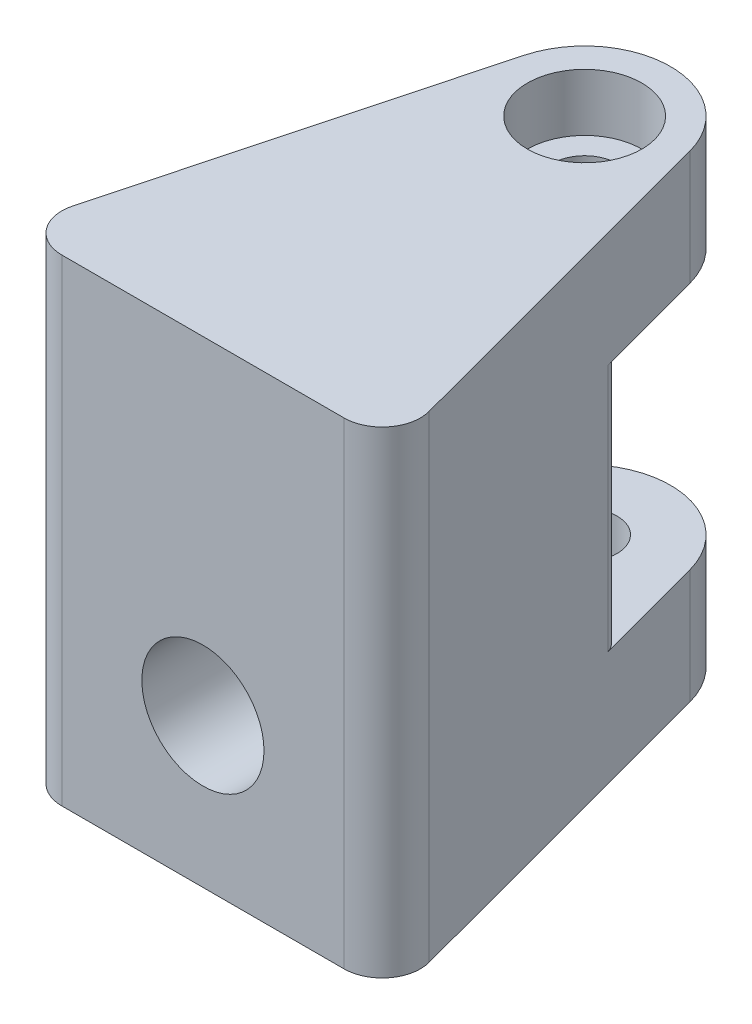
ISO-10303-21;
HEADER;
FILE_DESCRIPTION(('STEP AP214'),'2;1');
FILE_NAME('part.step','',(''),(''),'','','');
FILE_SCHEMA(('AUTOMOTIVE_DESIGN { 1 0 10303 214 1 1 1 1 }'));
ENDSEC;
DATA;
#1=APPLICATION_CONTEXT('core data for automotive mechanical design processes');
#2=APPLICATION_PROTOCOL_DEFINITION('international standard','automotive_design',2000,#1);
#3=PRODUCT_CONTEXT('',#1,'mechanical');
#4=PRODUCT('Part','Part','',(#3));
#5=PRODUCT_RELATED_PRODUCT_CATEGORY('part','',(#4));
#6=PRODUCT_DEFINITION_FORMATION('','',#4);
#7=PRODUCT_DEFINITION_CONTEXT('part definition',#1,'design');
#8=PRODUCT_DEFINITION('design','',#6,#7);
#9=PRODUCT_DEFINITION_SHAPE('','',#8);
#10=(LENGTH_UNIT() NAMED_UNIT(*) SI_UNIT(.MILLI.,.METRE.));
#11=(NAMED_UNIT(*) PLANE_ANGLE_UNIT() SI_UNIT($,.RADIAN.));
#12=(NAMED_UNIT(*) SI_UNIT($,.STERADIAN.) SOLID_ANGLE_UNIT());
#13=UNCERTAINTY_MEASURE_WITH_UNIT(LENGTH_MEASURE(1.E-05),#10,'distance_accuracy_value','');
#14=(GEOMETRIC_REPRESENTATION_CONTEXT(3) GLOBAL_UNCERTAINTY_ASSIGNED_CONTEXT((#13)) GLOBAL_UNIT_ASSIGNED_CONTEXT((#10,
#11,#12)) REPRESENTATION_CONTEXT('',''));
#15=CARTESIAN_POINT('',(0.,0.,0.));
#16=DIRECTION('',(0.,0.,1.));
#17=DIRECTION('',(1.,0.,0.));
#18=AXIS2_PLACEMENT_3D('',#15,#16,#17);
#19=CARTESIAN_POINT('',(0.,0.,0.));
#20=DIRECTION('',(0.,1.,0.));
#21=DIRECTION('',(0.,0.,1.));
#22=AXIS2_PLACEMENT_3D('',#19,#20,#21);
#23=CYLINDRICAL_SURFACE('',#22,1.7);
#24=CARTESIAN_POINT('',(0.,19.,0.));
#25=DIRECTION('',(0.,1.,0.));
#26=DIRECTION('',(0.,0.,1.));
#27=AXIS2_PLACEMENT_3D('',#24,#25,#26);
#28=CIRCLE('',#27,1.7);
#29=CARTESIAN_POINT('',(0.,19.,1.7));
#30=VERTEX_POINT('',#29);
#31=EDGE_CURVE('E207',#30,#30,#28,.F.);
#32=ORIENTED_EDGE('',*,*,#31,.T.);
#33=EDGE_LOOP('',(#32));
#34=FACE_BOUND('',#33,.T.);
#35=CARTESIAN_POINT('',(0.,22.,0.));
#36=DIRECTION('',(0.,1.,0.));
#37=DIRECTION('',(0.,0.,1.));
#38=AXIS2_PLACEMENT_3D('',#35,#36,#37);
#39=CIRCLE('',#38,1.7);
#40=CARTESIAN_POINT('',(0.,22.,1.7));
#41=VERTEX_POINT('',#40);
#42=EDGE_CURVE('E280',#41,#41,#39,.F.);
#43=ORIENTED_EDGE('',*,*,#42,.F.);
#44=EDGE_LOOP('',(#43));
#45=FACE_BOUND('',#44,.T.);
#46=ADVANCED_FACE('F43',(#34,#45),#23,.F.);
#47=CARTESIAN_POINT('',(0.,0.,0.));
#48=DIRECTION('',(0.,1.,0.));
#49=DIRECTION('',(0.,0.,1.));
#50=AXIS2_PLACEMENT_3D('',#47,#48,#49);
#51=PLANE('',#50);
#52=DIRECTION('',(-0.25806392227619,0.,-0.96612784455238));
#53=VECTOR('',#52,1.);
#54=CARTESIAN_POINT('',(10.,0.,20.));
#55=LINE('',#54,#53);
#56=CARTESIAN_POINT('',(9.32791314920194,0.,17.4838721554476));
#57=VERTEX_POINT('',#56);
#58=CARTESIAN_POINT('',(4.34757530048571,0.,-1.16128765024286));
#59=VERTEX_POINT('',#58);
#60=EDGE_CURVE('E232',#57,#59,#55,.T.);
#61=ORIENTED_EDGE('',*,*,#60,.F.);
#62=CARTESIAN_POINT('',(7.39565746009718,0.,18.));
#63=DIRECTION('',(0.,1.,0.));
#64=DIRECTION('',(0.,0.,1.));
#65=AXIS2_PLACEMENT_3D('',#62,#63,#64);
#66=CIRCLE('',#65,2.);
#67=CARTESIAN_POINT('',(7.39565746009718,0.,20.));
#68=VERTEX_POINT('',#67);
#69=EDGE_CURVE('E262',#57,#68,#66,.F.);
#70=ORIENTED_EDGE('',*,*,#69,.T.);
#71=DIRECTION('',(1.,0.,0.));
#72=VECTOR('',#71,1.);
#73=CARTESIAN_POINT('',(-10.,0.,20.));
#74=LINE('',#73,#72);
#75=CARTESIAN_POINT('',(-7.39565746009718,0.,20.));
#76=VERTEX_POINT('',#75);
#77=EDGE_CURVE('E246',#76,#68,#74,.T.);
#78=ORIENTED_EDGE('',*,*,#77,.F.);
#79=CARTESIAN_POINT('',(-7.39565746009718,0.,18.));
#80=DIRECTION('',(0.,1.,0.));
#81=DIRECTION('',(0.,0.,1.));
#82=AXIS2_PLACEMENT_3D('',#79,#80,#81);
#83=CIRCLE('',#82,2.);
#84=CARTESIAN_POINT('',(-9.32791314920194,0.,17.4838721554476));
#85=VERTEX_POINT('',#84);
#86=EDGE_CURVE('E260',#76,#85,#83,.F.);
#87=ORIENTED_EDGE('',*,*,#86,.T.);
#88=DIRECTION('',(-0.25806392227619,0.,0.96612784455238));
#89=VECTOR('',#88,1.);
#90=CARTESIAN_POINT('',(-4.34757530048571,0.,-1.16128765024286));
#91=LINE('',#90,#89);
#92=CARTESIAN_POINT('',(-4.34757530048571,0.,-1.16128765024286));
#93=VERTEX_POINT('',#92);
#94=EDGE_CURVE('E243',#93,#85,#91,.T.);
#95=ORIENTED_EDGE('',*,*,#94,.F.);
#96=CARTESIAN_POINT('',(0.,0.,0.));
#97=DIRECTION('',(0.,1.,0.));
#98=DIRECTION('',(0.,0.,1.));
#99=AXIS2_PLACEMENT_3D('',#96,#97,#98);
#100=CIRCLE('',#99,4.5);
#101=EDGE_CURVE('E225',#59,#93,#100,.T.);
#102=ORIENTED_EDGE('',*,*,#101,.F.);
#103=EDGE_LOOP('',(#61,#70,#78,#87,#95,#102));
#104=FACE_BOUND('',#103,.T.);
#105=DIRECTION('',(0.866025403784439,0.,0.5));
#106=VECTOR('',#105,1.);
#107=CARTESIAN_POINT('',(-3.,0.,1.73205080756888));
#108=LINE('',#107,#106);
#109=CARTESIAN_POINT('',(-3.,0.,1.73205080756888));
#110=VERTEX_POINT('',#109);
#111=CARTESIAN_POINT('',(0.,0.,3.46410161513776));
#112=VERTEX_POINT('',#111);
#113=EDGE_CURVE('E283',#110,#112,#108,.T.);
#114=ORIENTED_EDGE('',*,*,#113,.T.);
#115=DIRECTION('',(0.866025403784439,0.,-0.5));
#116=VECTOR('',#115,1.);
#117=CARTESIAN_POINT('',(0.,0.,3.46410161513776));
#118=LINE('',#117,#116);
#119=CARTESIAN_POINT('',(3.,0.,1.73205080756888));
#120=VERTEX_POINT('',#119);
#121=EDGE_CURVE('E191',#112,#120,#118,.T.);
#122=ORIENTED_EDGE('',*,*,#121,.T.);
#123=DIRECTION('',(0.,0.,-1.));
#124=VECTOR('',#123,1.);
#125=CARTESIAN_POINT('',(3.,0.,1.73205080756888));
#126=LINE('',#125,#124);
#127=CARTESIAN_POINT('',(3.,0.,-1.73205080756888));
#128=VERTEX_POINT('',#127);
#129=EDGE_CURVE('E605',#120,#128,#126,.T.);
#130=ORIENTED_EDGE('',*,*,#129,.T.);
#131=DIRECTION('',(-0.866025403784439,0.,-0.5));
#132=VECTOR('',#131,1.);
#133=CARTESIAN_POINT('',(3.,0.,-1.73205080756888));
#134=LINE('',#133,#132);
#135=CARTESIAN_POINT('',(0.,0.,-3.46410161513775));
#136=VERTEX_POINT('',#135);
#137=EDGE_CURVE('E608',#128,#136,#134,.T.);
#138=ORIENTED_EDGE('',*,*,#137,.T.);
#139=DIRECTION('',(-0.866025403784439,0.,0.5));
#140=VECTOR('',#139,1.);
#141=CARTESIAN_POINT('',(0.,0.,-3.46410161513775));
#142=LINE('',#141,#140);
#143=CARTESIAN_POINT('',(-3.,0.,-1.73205080756888));
#144=VERTEX_POINT('',#143);
#145=EDGE_CURVE('E611',#136,#144,#142,.T.);
#146=ORIENTED_EDGE('',*,*,#145,.T.);
#147=DIRECTION('',(0.,0.,1.));
#148=VECTOR('',#147,1.);
#149=CARTESIAN_POINT('',(-3.,0.,-1.73205080756888));
#150=LINE('',#149,#148);
#151=EDGE_CURVE('E187',#144,#110,#150,.T.);
#152=ORIENTED_EDGE('',*,*,#151,.T.);
#153=EDGE_LOOP('',(#114,#122,#130,#138,#146,#152));
#154=FACE_BOUND('',#153,.T.);
#155=ADVANCED_FACE('F316',(#104,#154),#51,.F.);
#156=CARTESIAN_POINT('',(0.,25.,0.));
#157=DIRECTION('',(0.,-1.,0.));
#158=DIRECTION('',(0.,0.,-1.));
#159=AXIS2_PLACEMENT_3D('',#156,#157,#158);
#160=CYLINDRICAL_SURFACE('',#159,4.5);
#161=CARTESIAN_POINT('',(0.,6.,0.));
#162=DIRECTION('',(0.,1.,0.));
#163=DIRECTION('',(0.,0.,1.));
#164=AXIS2_PLACEMENT_3D('',#161,#162,#163);
#165=CIRCLE('',#164,4.5);
#166=CARTESIAN_POINT('',(4.34757530048571,6.,-1.16128765024285));
#167=VERTEX_POINT('',#166);
#168=CARTESIAN_POINT('',(-4.34757530048571,6.,-1.16128765024286));
#169=VERTEX_POINT('',#168);
#170=EDGE_CURVE('E218',#167,#169,#165,.T.);
#171=ORIENTED_EDGE('',*,*,#170,.F.);
#172=DIRECTION('',(0.,-1.,0.));
#173=VECTOR('',#172,1.);
#174=CARTESIAN_POINT('',(4.34757530048571,25.,-1.16128765024286));
#175=LINE('',#174,#173);
#176=EDGE_CURVE('E240',#167,#59,#175,.T.);
#177=ORIENTED_EDGE('',*,*,#176,.T.);
#178=ORIENTED_EDGE('',*,*,#101,.T.);
#179=DIRECTION('',(0.,-1.,0.));
#180=VECTOR('',#179,1.);
#181=CARTESIAN_POINT('',(-4.34757530048571,25.,-1.16128765024286));
#182=LINE('',#181,#180);
#183=EDGE_CURVE('E254',#169,#93,#182,.T.);
#184=ORIENTED_EDGE('',*,*,#183,.F.);
#185=EDGE_LOOP('',(#171,#177,#178,#184));
#186=FACE_BOUND('',#185,.T.);
#187=ADVANCED_FACE('F311',(#186),#160,.T.);
#188=CARTESIAN_POINT('',(-4.34757530048571,25.,-1.16128765024286));
#189=DIRECTION('',(0.96612784455238,0.,0.25806392227619));
#190=DIRECTION('',(0.25806392227619,0.,-0.96612784455238));
#191=AXIS2_PLACEMENT_3D('',#188,#189,#190);
#192=PLANE('',#191);
#193=DIRECTION('',(-0.25806392227619,0.,0.96612784455238));
#194=VECTOR('',#193,1.);
#195=CARTESIAN_POINT('',(-4.34757530048571,19.,-1.16128765024286));
#196=LINE('',#195,#194);
#197=CARTESIAN_POINT('',(-4.34757530048571,19.,-1.16128765024286));
#198=VERTEX_POINT('',#197);
#199=CARTESIAN_POINT('',(-5.91200468792575,19.,4.6955511465582));
#200=VERTEX_POINT('',#199);
#201=EDGE_CURVE('E58',#198,#200,#196,.T.);
#202=ORIENTED_EDGE('',*,*,#201,.T.);
#203=DIRECTION('',(0.,1.,0.));
#204=VECTOR('',#203,1.);
#205=CARTESIAN_POINT('',(-5.91200468792575,6.,4.6955511465582));
#206=LINE('',#205,#204);
#207=CARTESIAN_POINT('',(-5.91200468792575,6.,4.6955511465582));
#208=VERTEX_POINT('',#207);
#209=EDGE_CURVE('E293',#200,#208,#206,.F.);
#210=ORIENTED_EDGE('',*,*,#209,.T.);
#211=DIRECTION('',(-0.25806392227619,0.,0.96612784455238));
#212=VECTOR('',#211,1.);
#213=CARTESIAN_POINT('',(-4.34757530048571,6.,-1.16128765024286));
#214=LINE('',#213,#212);
#215=EDGE_CURVE('E65',#169,#208,#214,.T.);
#216=ORIENTED_EDGE('',*,*,#215,.F.);
#217=ORIENTED_EDGE('',*,*,#183,.T.);
#218=ORIENTED_EDGE('',*,*,#94,.T.);
#219=DIRECTION('',(0.,-1.,0.));
#220=VECTOR('',#219,1.);
#221=CARTESIAN_POINT('',(-9.32791314920194,25.,17.4838721554476));
#222=LINE('',#221,#220);
#223=CARTESIAN_POINT('',(-9.32791314920194,25.,17.4838721554476));
#224=VERTEX_POINT('',#223);
#225=EDGE_CURVE('E273',#85,#224,#222,.F.);
#226=ORIENTED_EDGE('',*,*,#225,.T.);
#227=DIRECTION('',(-0.25806392227619,0.,0.96612784455238));
#228=VECTOR('',#227,1.);
#229=CARTESIAN_POINT('',(-4.34757530048571,25.,-1.16128765024286));
#230=LINE('',#229,#228);
#231=CARTESIAN_POINT('',(-4.34757530048571,25.,-1.16128765024286));
#232=VERTEX_POINT('',#231);
#233=EDGE_CURVE('E231',#232,#224,#230,.T.);
#234=ORIENTED_EDGE('',*,*,#233,.F.);
#235=EDGE_CURVE('E255',#232,#198,#182,.T.);
#236=ORIENTED_EDGE('',*,*,#235,.T.);
#237=EDGE_LOOP('',(#202,#210,#216,#217,#218,#226,#234,#236));
#238=FACE_BOUND('',#237,.T.);
#239=ADVANCED_FACE('F306',(#238),#192,.F.);
#240=CARTESIAN_POINT('',(10.,25.,20.));
#241=DIRECTION('',(-0.96612784455238,0.,0.25806392227619));
#242=DIRECTION('',(0.25806392227619,0.,0.96612784455238));
#243=AXIS2_PLACEMENT_3D('',#240,#241,#242);
#244=PLANE('',#243);
#245=DIRECTION('',(-0.25806392227619,0.,-0.96612784455238));
#246=VECTOR('',#245,1.);
#247=CARTESIAN_POINT('',(10.,6.,20.));
#248=LINE('',#247,#246);
#249=CARTESIAN_POINT('',(5.91200468792575,6.,4.6955511465582));
#250=VERTEX_POINT('',#249);
#251=EDGE_CURVE('E216',#250,#167,#248,.T.);
#252=ORIENTED_EDGE('',*,*,#251,.F.);
#253=DIRECTION('',(0.,1.,0.));
#254=VECTOR('',#253,1.);
#255=CARTESIAN_POINT('',(5.91200468792575,19.,4.6955511465582));
#256=LINE('',#255,#254);
#257=CARTESIAN_POINT('',(5.91200468792574,19.,4.69555114655819));
#258=VERTEX_POINT('',#257);
#259=EDGE_CURVE('E290',#250,#258,#256,.T.);
#260=ORIENTED_EDGE('',*,*,#259,.T.);
#261=DIRECTION('',(-0.25806392227619,0.,-0.96612784455238));
#262=VECTOR('',#261,1.);
#263=CARTESIAN_POINT('',(10.,19.,20.));
#264=LINE('',#263,#262);
#265=CARTESIAN_POINT('',(4.34757530048571,19.,-1.16128765024286));
#266=VERTEX_POINT('',#265);
#267=EDGE_CURVE('E208',#258,#266,#264,.T.);
#268=ORIENTED_EDGE('',*,*,#267,.T.);
#269=CARTESIAN_POINT('',(4.34757530048571,25.,-1.16128765024286));
#270=VERTEX_POINT('',#269);
#271=EDGE_CURVE('E251',#270,#266,#175,.T.);
#272=ORIENTED_EDGE('',*,*,#271,.F.);
#273=DIRECTION('',(-0.25806392227619,0.,-0.96612784455238));
#274=VECTOR('',#273,1.);
#275=CARTESIAN_POINT('',(10.,25.,20.));
#276=LINE('',#275,#274);
#277=CARTESIAN_POINT('',(9.32791314920194,25.,17.4838721554476));
#278=VERTEX_POINT('',#277);
#279=EDGE_CURVE('E238',#278,#270,#276,.T.);
#280=ORIENTED_EDGE('',*,*,#279,.F.);
#281=DIRECTION('',(0.,-1.,0.));
#282=VECTOR('',#281,1.);
#283=CARTESIAN_POINT('',(9.32791314920194,25.,17.4838721554476));
#284=LINE('',#283,#282);
#285=EDGE_CURVE('E257',#278,#57,#284,.T.);
#286=ORIENTED_EDGE('',*,*,#285,.T.);
#287=ORIENTED_EDGE('',*,*,#60,.T.);
#288=ORIENTED_EDGE('',*,*,#176,.F.);
#289=EDGE_LOOP('',(#252,#260,#268,#272,#280,#286,#287,#288));
#290=FACE_BOUND('',#289,.T.);
#291=ADVANCED_FACE('F337',(#290),#244,.F.);
#292=CARTESIAN_POINT('',(0.,2.4,0.));
#293=DIRECTION('',(0.,1.,0.));
#294=DIRECTION('',(0.,0.,1.));
#295=AXIS2_PLACEMENT_3D('',#292,#293,#294);
#296=CIRCLE('',#295,1.7);
#297=CARTESIAN_POINT('',(0.,2.4,1.7));
#298=VERTEX_POINT('',#297);
#299=EDGE_CURVE('E192',#298,#298,#296,.F.);
#300=ORIENTED_EDGE('',*,*,#299,.T.);
#301=EDGE_LOOP('',(#300));
#302=FACE_BOUND('',#301,.T.);
#303=CARTESIAN_POINT('',(0.,6.,0.));
#304=DIRECTION('',(0.,1.,0.));
#305=DIRECTION('',(0.,0.,1.));
#306=AXIS2_PLACEMENT_3D('',#303,#304,#305);
#307=CIRCLE('',#306,1.7);
#308=CARTESIAN_POINT('',(0.,6.,1.7));
#309=VERTEX_POINT('',#308);
#310=EDGE_CURVE('E215',#309,#309,#307,.F.);
#311=ORIENTED_EDGE('',*,*,#310,.F.);
#312=EDGE_LOOP('',(#311));
#313=FACE_BOUND('',#312,.T.);
#314=ADVANCED_FACE('F365',(#302,#313),#23,.F.);
#315=ORIENTED_EDGE('',*,*,#271,.T.);
#316=CARTESIAN_POINT('',(0.,19.,0.));
#317=DIRECTION('',(0.,1.,0.));
#318=DIRECTION('',(0.,0.,1.));
#319=AXIS2_PLACEMENT_3D('',#316,#317,#318);
#320=CIRCLE('',#319,4.5);
#321=EDGE_CURVE('E211',#266,#198,#320,.T.);
#322=ORIENTED_EDGE('',*,*,#321,.T.);
#323=ORIENTED_EDGE('',*,*,#235,.F.);
#324=CARTESIAN_POINT('',(0.,25.,0.));
#325=DIRECTION('',(0.,1.,0.));
#326=DIRECTION('',(0.,0.,1.));
#327=AXIS2_PLACEMENT_3D('',#324,#325,#326);
#328=CIRCLE('',#327,4.5);
#329=EDGE_CURVE('E228',#270,#232,#328,.T.);
#330=ORIENTED_EDGE('',*,*,#329,.F.);
#331=EDGE_LOOP('',(#315,#322,#323,#330));
#332=FACE_BOUND('',#331,.T.);
#333=ADVANCED_FACE('F341',(#332),#160,.T.);
#334=CARTESIAN_POINT('',(-10.,25.,20.));
#335=DIRECTION('',(0.,0.,-1.));
#336=DIRECTION('',(-1.,0.,0.));
#337=AXIS2_PLACEMENT_3D('',#334,#335,#336);
#338=PLANE('',#337);
#339=CARTESIAN_POINT('',(0.,7.8,20.));
#340=DIRECTION('',(0.,0.,1.));
#341=DIRECTION('',(1.,0.,0.));
#342=AXIS2_PLACEMENT_3D('',#339,#340,#341);
#343=CIRCLE('',#342,3.2);
#344=CARTESIAN_POINT('',(3.2,7.8,20.));
#345=VERTEX_POINT('',#344);
#346=EDGE_CURVE('E221',#345,#345,#343,.T.);
#347=ORIENTED_EDGE('',*,*,#346,.F.);
#348=EDGE_LOOP('',(#347));
#349=FACE_BOUND('',#348,.T.);
#350=ORIENTED_EDGE('',*,*,#77,.T.);
#351=DIRECTION('',(0.,-1.,0.));
#352=VECTOR('',#351,1.);
#353=CARTESIAN_POINT('',(7.39565746009718,25.,20.));
#354=LINE('',#353,#352);
#355=CARTESIAN_POINT('',(7.39565746009718,25.,20.));
#356=VERTEX_POINT('',#355);
#357=EDGE_CURVE('E267',#68,#356,#354,.F.);
#358=ORIENTED_EDGE('',*,*,#357,.T.);
#359=DIRECTION('',(1.,0.,0.));
#360=VECTOR('',#359,1.);
#361=CARTESIAN_POINT('',(-10.,25.,20.));
#362=LINE('',#361,#360);
#363=CARTESIAN_POINT('',(-7.39565746009718,25.,20.));
#364=VERTEX_POINT('',#363);
#365=EDGE_CURVE('E235',#364,#356,#362,.T.);
#366=ORIENTED_EDGE('',*,*,#365,.F.);
#367=DIRECTION('',(0.,-1.,0.));
#368=VECTOR('',#367,1.);
#369=CARTESIAN_POINT('',(-7.39565746009718,25.,20.));
#370=LINE('',#369,#368);
#371=EDGE_CURVE('E264',#364,#76,#370,.T.);
#372=ORIENTED_EDGE('',*,*,#371,.T.);
#373=EDGE_LOOP('',(#350,#358,#366,#372));
#374=FACE_BOUND('',#373,.T.);
#375=ADVANCED_FACE('F329',(#349,#374),#338,.F.);
#376=CARTESIAN_POINT('',(0.,25.,0.));
#377=DIRECTION('',(0.,1.,0.));
#378=DIRECTION('',(0.,0.,1.));
#379=AXIS2_PLACEMENT_3D('',#376,#377,#378);
#380=PLANE('',#379);
#381=CARTESIAN_POINT('',(0.,25.,0.));
#382=DIRECTION('',(0.,1.,0.));
#383=DIRECTION('',(0.,0.,1.));
#384=AXIS2_PLACEMENT_3D('',#381,#382,#383);
#385=CIRCLE('',#384,3.);
#386=CARTESIAN_POINT('',(0.,25.,3.));
#387=VERTEX_POINT('',#386);
#388=EDGE_CURVE('E590',#387,#387,#385,.T.);
#389=ORIENTED_EDGE('',*,*,#388,.F.);
#390=EDGE_LOOP('',(#389));
#391=FACE_BOUND('',#390,.T.);
#392=ORIENTED_EDGE('',*,*,#365,.T.);
#393=CARTESIAN_POINT('',(7.39565746009718,25.,18.));
#394=DIRECTION('',(0.,1.,0.));
#395=DIRECTION('',(0.,0.,1.));
#396=AXIS2_PLACEMENT_3D('',#393,#394,#395);
#397=CIRCLE('',#396,2.);
#398=EDGE_CURVE('E271',#356,#278,#397,.T.);
#399=ORIENTED_EDGE('',*,*,#398,.T.);
#400=ORIENTED_EDGE('',*,*,#279,.T.);
#401=ORIENTED_EDGE('',*,*,#329,.T.);
#402=ORIENTED_EDGE('',*,*,#233,.T.);
#403=CARTESIAN_POINT('',(-7.39565746009718,25.,18.));
#404=DIRECTION('',(0.,1.,0.));
#405=DIRECTION('',(0.,0.,1.));
#406=AXIS2_PLACEMENT_3D('',#403,#404,#405);
#407=CIRCLE('',#406,2.);
#408=EDGE_CURVE('E269',#224,#364,#407,.T.);
#409=ORIENTED_EDGE('',*,*,#408,.T.);
#410=EDGE_LOOP('',(#392,#399,#400,#401,#402,#409));
#411=FACE_BOUND('',#410,.T.);
#412=ADVANCED_FACE('F326',(#391,#411),#380,.T.);
#413=CARTESIAN_POINT('',(0.,7.8,8.));
#414=DIRECTION('',(0.,0.,1.));
#415=DIRECTION('',(1.,0.,0.));
#416=AXIS2_PLACEMENT_3D('',#413,#414,#415);
#417=CYLINDRICAL_SURFACE('',#416,3.2);
#418=CARTESIAN_POINT('',(0.,7.8,8.));
#419=DIRECTION('',(0.,0.,1.));
#420=DIRECTION('',(1.,0.,0.));
#421=AXIS2_PLACEMENT_3D('',#418,#419,#420);
#422=CIRCLE('',#421,3.2);
#423=CARTESIAN_POINT('',(3.2,7.8,8.));
#424=VERTEX_POINT('',#423);
#425=EDGE_CURVE('E222',#424,#424,#422,.T.);
#426=ORIENTED_EDGE('',*,*,#425,.F.);
#427=EDGE_LOOP('',(#426));
#428=FACE_BOUND('',#427,.T.);
#429=ORIENTED_EDGE('',*,*,#346,.T.);
#430=EDGE_LOOP('',(#429));
#431=FACE_BOUND('',#430,.T.);
#432=ADVANCED_FACE('F549',(#428,#431),#417,.F.);
#433=CARTESIAN_POINT('',(0.,7.8,8.));
#434=DIRECTION('',(0.,0.,1.));
#435=DIRECTION('',(1.,0.,0.));
#436=AXIS2_PLACEMENT_3D('',#433,#434,#435);
#437=PLANE('',#436);
#438=ORIENTED_EDGE('',*,*,#425,.T.);
#439=EDGE_LOOP('',(#438));
#440=FACE_BOUND('',#439,.T.);
#441=ADVANCED_FACE('F540',(#440),#437,.T.);
#442=CARTESIAN_POINT('',(7.39565746009718,25.,18.));
#443=DIRECTION('',(0.,-1.,0.));
#444=DIRECTION('',(0.,0.,-1.));
#445=AXIS2_PLACEMENT_3D('',#442,#443,#444);
#446=CYLINDRICAL_SURFACE('',#445,2.);
#447=ORIENTED_EDGE('',*,*,#398,.F.);
#448=ORIENTED_EDGE('',*,*,#357,.F.);
#449=ORIENTED_EDGE('',*,*,#69,.F.);
#450=ORIENTED_EDGE('',*,*,#285,.F.);
#451=EDGE_LOOP('',(#447,#448,#449,#450));
#452=FACE_BOUND('',#451,.T.);
#453=ADVANCED_FACE('F332',(#452),#446,.T.);
#454=CARTESIAN_POINT('',(-7.39565746009718,25.,18.));
#455=DIRECTION('',(0.,-1.,0.));
#456=DIRECTION('',(0.,0.,-1.));
#457=AXIS2_PLACEMENT_3D('',#454,#455,#456);
#458=CYLINDRICAL_SURFACE('',#457,2.);
#459=ORIENTED_EDGE('',*,*,#408,.F.);
#460=ORIENTED_EDGE('',*,*,#225,.F.);
#461=ORIENTED_EDGE('',*,*,#86,.F.);
#462=ORIENTED_EDGE('',*,*,#371,.F.);
#463=EDGE_LOOP('',(#459,#460,#461,#462));
#464=FACE_BOUND('',#463,.T.);
#465=ADVANCED_FACE('F322',(#464),#458,.T.);
#466=CARTESIAN_POINT('',(0.,41.9705627484771,0.));
#467=DIRECTION('',(0.,-1.,0.));
#468=DIRECTION('',(0.,0.,-1.));
#469=AXIS2_PLACEMENT_3D('',#466,#467,#468);
#470=CYLINDRICAL_SURFACE('',#469,6.);
#471=CARTESIAN_POINT('',(0.,19.,0.));
#472=DIRECTION('',(0.,1.,0.));
#473=DIRECTION('',(0.,0.,1.));
#474=AXIS2_PLACEMENT_3D('',#471,#472,#473);
#475=CIRCLE('',#474,6.);
#476=CARTESIAN_POINT('',(-4.23932300860574,19.,4.24595577328662));
#477=VERTEX_POINT('',#476);
#478=CARTESIAN_POINT('',(4.23932300860574,19.,4.24595577328662));
#479=VERTEX_POINT('',#478);
#480=EDGE_CURVE('E204',#477,#479,#475,.T.);
#481=ORIENTED_EDGE('',*,*,#480,.T.);
#482=DIRECTION('',(0.,-1.,0.));
#483=VECTOR('',#482,1.);
#484=CARTESIAN_POINT('',(4.23932300860574,41.9705627484771,4.24595577328662));
#485=LINE('',#484,#483);
#486=CARTESIAN_POINT('',(4.23932300860574,6.,4.24595577328662));
#487=VERTEX_POINT('',#486);
#488=EDGE_CURVE('E287',#479,#487,#485,.T.);
#489=ORIENTED_EDGE('',*,*,#488,.T.);
#490=CARTESIAN_POINT('',(0.,6.,0.));
#491=DIRECTION('',(0.,1.,0.));
#492=DIRECTION('',(0.,0.,1.));
#493=AXIS2_PLACEMENT_3D('',#490,#491,#492);
#494=CIRCLE('',#493,6.);
#495=CARTESIAN_POINT('',(-4.23932300860574,6.,4.24595577328662));
#496=VERTEX_POINT('',#495);
#497=EDGE_CURVE('E196',#496,#487,#494,.T.);
#498=ORIENTED_EDGE('',*,*,#497,.F.);
#499=DIRECTION('',(0.,-1.,0.));
#500=VECTOR('',#499,1.);
#501=CARTESIAN_POINT('',(-4.23932300860574,41.9705627484771,4.24595577328662));
#502=LINE('',#501,#500);
#503=EDGE_CURVE('E275',#496,#477,#502,.F.);
#504=ORIENTED_EDGE('',*,*,#503,.T.);
#505=EDGE_LOOP('',(#481,#489,#498,#504));
#506=FACE_BOUND('',#505,.T.);
#507=ADVANCED_FACE('F349',(#506),#470,.F.);
#508=CARTESIAN_POINT('',(0.,6.,0.));
#509=DIRECTION('',(0.,1.,0.));
#510=DIRECTION('',(0.,0.,1.));
#511=AXIS2_PLACEMENT_3D('',#508,#509,#510);
#512=PLANE('',#511);
#513=ORIENTED_EDGE('',*,*,#310,.T.);
#514=EDGE_LOOP('',(#513));
#515=FACE_BOUND('',#514,.T.);
#516=ORIENTED_EDGE('',*,*,#215,.T.);
#517=CARTESIAN_POINT('',(-4.94587684337337,6.,4.95361506883439));
#518=DIRECTION('',(0.,1.,0.));
#519=DIRECTION('',(0.,0.,1.));
#520=AXIS2_PLACEMENT_3D('',#517,#518,#519);
#521=CIRCLE('',#520,1.);
#522=EDGE_CURVE('E12',#208,#496,#521,.F.);
#523=ORIENTED_EDGE('',*,*,#522,.T.);
#524=ORIENTED_EDGE('',*,*,#497,.T.);
#525=CARTESIAN_POINT('',(4.94587684337337,6.,4.95361506883439));
#526=DIRECTION('',(0.,1.,0.));
#527=DIRECTION('',(0.,0.,1.));
#528=AXIS2_PLACEMENT_3D('',#525,#526,#527);
#529=CIRCLE('',#528,1.);
#530=EDGE_CURVE('E295',#487,#250,#529,.F.);
#531=ORIENTED_EDGE('',*,*,#530,.T.);
#532=ORIENTED_EDGE('',*,*,#251,.T.);
#533=ORIENTED_EDGE('',*,*,#170,.T.);
#534=EDGE_LOOP('',(#516,#523,#524,#531,#532,#533));
#535=FACE_BOUND('',#534,.T.);
#536=ADVANCED_FACE('F350',(#515,#535),#512,.T.);
#537=CARTESIAN_POINT('',(0.,19.,0.));
#538=DIRECTION('',(0.,1.,0.));
#539=DIRECTION('',(0.,0.,1.));
#540=AXIS2_PLACEMENT_3D('',#537,#538,#539);
#541=PLANE('',#540);
#542=ORIENTED_EDGE('',*,*,#31,.F.);
#543=EDGE_LOOP('',(#542));
#544=FACE_BOUND('',#543,.T.);
#545=ORIENTED_EDGE('',*,*,#321,.F.);
#546=ORIENTED_EDGE('',*,*,#267,.F.);
#547=CARTESIAN_POINT('',(4.94587684337337,19.,4.95361506883439));
#548=DIRECTION('',(0.,1.,0.));
#549=DIRECTION('',(0.,0.,1.));
#550=AXIS2_PLACEMENT_3D('',#547,#548,#549);
#551=CIRCLE('',#550,1.);
#552=EDGE_CURVE('E298',#258,#479,#551,.T.);
#553=ORIENTED_EDGE('',*,*,#552,.T.);
#554=ORIENTED_EDGE('',*,*,#480,.F.);
#555=CARTESIAN_POINT('',(-4.94587684337337,19.,4.95361506883439));
#556=DIRECTION('',(0.,1.,0.));
#557=DIRECTION('',(0.,0.,1.));
#558=AXIS2_PLACEMENT_3D('',#555,#556,#557);
#559=CIRCLE('',#558,1.);
#560=EDGE_CURVE('E51',#477,#200,#559,.T.);
#561=ORIENTED_EDGE('',*,*,#560,.T.);
#562=ORIENTED_EDGE('',*,*,#201,.F.);
#563=EDGE_LOOP('',(#545,#546,#553,#554,#561,#562));
#564=FACE_BOUND('',#563,.T.);
#565=ADVANCED_FACE('F302',(#544,#564),#541,.F.);
#566=CARTESIAN_POINT('',(0.,2.4,0.));
#567=DIRECTION('',(0.,1.,0.));
#568=DIRECTION('',(0.,0.,1.));
#569=AXIS2_PLACEMENT_3D('',#566,#567,#568);
#570=PLANE('',#569);
#571=DIRECTION('',(0.866025403784439,0.,0.5));
#572=VECTOR('',#571,1.);
#573=CARTESIAN_POINT('',(-3.,2.4,1.73205080756888));
#574=LINE('',#573,#572);
#575=CARTESIAN_POINT('',(-3.,2.4,1.73205080756888));
#576=VERTEX_POINT('',#575);
#577=CARTESIAN_POINT('',(0.,2.4,3.46410161513776));
#578=VERTEX_POINT('',#577);
#579=EDGE_CURVE('E172',#576,#578,#574,.T.);
#580=ORIENTED_EDGE('',*,*,#579,.F.);
#581=DIRECTION('',(0.,0.,1.));
#582=VECTOR('',#581,1.);
#583=CARTESIAN_POINT('',(-3.,2.4,-1.73205080756888));
#584=LINE('',#583,#582);
#585=CARTESIAN_POINT('',(-3.,2.4,-1.73205080756888));
#586=VERTEX_POINT('',#585);
#587=EDGE_CURVE('E601',#586,#576,#584,.T.);
#588=ORIENTED_EDGE('',*,*,#587,.F.);
#589=DIRECTION('',(-0.866025403784439,0.,0.5));
#590=VECTOR('',#589,1.);
#591=CARTESIAN_POINT('',(0.,2.4,-3.46410161513775));
#592=LINE('',#591,#590);
#593=CARTESIAN_POINT('',(0.,2.4,-3.46410161513775));
#594=VERTEX_POINT('',#593);
#595=EDGE_CURVE('E599',#594,#586,#592,.T.);
#596=ORIENTED_EDGE('',*,*,#595,.F.);
#597=DIRECTION('',(-0.866025403784439,0.,-0.5));
#598=VECTOR('',#597,1.);
#599=CARTESIAN_POINT('',(3.,2.4,-1.73205080756888));
#600=LINE('',#599,#598);
#601=CARTESIAN_POINT('',(3.,2.4,-1.73205080756888));
#602=VERTEX_POINT('',#601);
#603=EDGE_CURVE('E597',#602,#594,#600,.T.);
#604=ORIENTED_EDGE('',*,*,#603,.F.);
#605=DIRECTION('',(0.,0.,-1.));
#606=VECTOR('',#605,1.);
#607=CARTESIAN_POINT('',(3.,2.4,1.73205080756888));
#608=LINE('',#607,#606);
#609=CARTESIAN_POINT('',(3.,2.4,1.73205080756888));
#610=VERTEX_POINT('',#609);
#611=EDGE_CURVE('E174',#610,#602,#608,.T.);
#612=ORIENTED_EDGE('',*,*,#611,.F.);
#613=DIRECTION('',(0.866025403784439,0.,-0.5));
#614=VECTOR('',#613,1.);
#615=CARTESIAN_POINT('',(0.,2.4,3.46410161513776));
#616=LINE('',#615,#614);
#617=EDGE_CURVE('E167',#578,#610,#616,.T.);
#618=ORIENTED_EDGE('',*,*,#617,.F.);
#619=EDGE_LOOP('',(#580,#588,#596,#604,#612,#618));
#620=FACE_BOUND('',#619,.T.);
#621=ORIENTED_EDGE('',*,*,#299,.F.);
#622=EDGE_LOOP('',(#621));
#623=FACE_BOUND('',#622,.T.);
#624=ADVANCED_FACE('F169',(#620,#623),#570,.F.);
#625=CARTESIAN_POINT('',(-3.,2.4,1.73205080756888));
#626=DIRECTION('',(0.5,0.,-0.866025403784439));
#627=DIRECTION('',(-0.866025403784439,0.,-0.5));
#628=AXIS2_PLACEMENT_3D('',#625,#626,#627);
#629=PLANE('',#628);
#630=ORIENTED_EDGE('',*,*,#113,.F.);
#631=DIRECTION('',(0.,-1.,0.));
#632=VECTOR('',#631,1.);
#633=CARTESIAN_POINT('',(-3.,2.4,1.73205080756888));
#634=LINE('',#633,#632);
#635=EDGE_CURVE('E186',#576,#110,#634,.T.);
#636=ORIENTED_EDGE('',*,*,#635,.F.);
#637=ORIENTED_EDGE('',*,*,#579,.T.);
#638=DIRECTION('',(0.,-1.,0.));
#639=VECTOR('',#638,1.);
#640=CARTESIAN_POINT('',(0.,2.4,3.46410161513776));
#641=LINE('',#640,#639);
#642=EDGE_CURVE('E183',#578,#112,#641,.T.);
#643=ORIENTED_EDGE('',*,*,#642,.T.);
#644=EDGE_LOOP('',(#630,#636,#637,#643));
#645=FACE_BOUND('',#644,.T.);
#646=ADVANCED_FACE('F182',(#645),#629,.T.);
#647=CARTESIAN_POINT('',(0.,2.4,3.46410161513776));
#648=DIRECTION('',(-0.5,0.,-0.866025403784439));
#649=DIRECTION('',(-0.866025403784439,0.,0.5));
#650=AXIS2_PLACEMENT_3D('',#647,#648,#649);
#651=PLANE('',#650);
#652=ORIENTED_EDGE('',*,*,#121,.F.);
#653=ORIENTED_EDGE('',*,*,#642,.F.);
#654=ORIENTED_EDGE('',*,*,#617,.T.);
#655=DIRECTION('',(0.,-1.,0.));
#656=VECTOR('',#655,1.);
#657=CARTESIAN_POINT('',(3.,2.4,1.73205080756888));
#658=LINE('',#657,#656);
#659=EDGE_CURVE('E193',#610,#120,#658,.T.);
#660=ORIENTED_EDGE('',*,*,#659,.T.);
#661=EDGE_LOOP('',(#652,#653,#654,#660));
#662=FACE_BOUND('',#661,.T.);
#663=ADVANCED_FACE('F189',(#662),#651,.T.);
#664=CARTESIAN_POINT('',(3.,2.4,1.73205080756888));
#665=DIRECTION('',(-1.,0.,0.));
#666=DIRECTION('',(0.,0.,1.));
#667=AXIS2_PLACEMENT_3D('',#664,#665,#666);
#668=PLANE('',#667);
#669=ORIENTED_EDGE('',*,*,#129,.F.);
#670=ORIENTED_EDGE('',*,*,#659,.F.);
#671=ORIENTED_EDGE('',*,*,#611,.T.);
#672=DIRECTION('',(0.,-1.,0.));
#673=VECTOR('',#672,1.);
#674=CARTESIAN_POINT('',(3.,2.4,-1.73205080756888));
#675=LINE('',#674,#673);
#676=EDGE_CURVE('E198',#602,#128,#675,.T.);
#677=ORIENTED_EDGE('',*,*,#676,.T.);
#678=EDGE_LOOP('',(#669,#670,#671,#677));
#679=FACE_BOUND('',#678,.T.);
#680=ADVANCED_FACE('F404',(#679),#668,.T.);
#681=CARTESIAN_POINT('',(3.,2.4,-1.73205080756888));
#682=DIRECTION('',(-0.5,0.,0.866025403784439));
#683=DIRECTION('',(0.866025403784439,0.,0.5));
#684=AXIS2_PLACEMENT_3D('',#681,#682,#683);
#685=PLANE('',#684);
#686=ORIENTED_EDGE('',*,*,#137,.F.);
#687=ORIENTED_EDGE('',*,*,#676,.F.);
#688=ORIENTED_EDGE('',*,*,#603,.T.);
#689=DIRECTION('',(0.,-1.,0.));
#690=VECTOR('',#689,1.);
#691=CARTESIAN_POINT('',(0.,2.4,-3.46410161513775));
#692=LINE('',#691,#690);
#693=EDGE_CURVE('E619',#594,#136,#692,.T.);
#694=ORIENTED_EDGE('',*,*,#693,.T.);
#695=EDGE_LOOP('',(#686,#687,#688,#694));
#696=FACE_BOUND('',#695,.T.);
#697=ADVANCED_FACE('F400',(#696),#685,.T.);
#698=CARTESIAN_POINT('',(0.,2.4,-3.46410161513775));
#699=DIRECTION('',(0.5,0.,0.866025403784439));
#700=DIRECTION('',(0.866025403784439,0.,-0.5));
#701=AXIS2_PLACEMENT_3D('',#698,#699,#700);
#702=PLANE('',#701);
#703=ORIENTED_EDGE('',*,*,#145,.F.);
#704=ORIENTED_EDGE('',*,*,#693,.F.);
#705=ORIENTED_EDGE('',*,*,#595,.T.);
#706=DIRECTION('',(0.,-1.,0.));
#707=VECTOR('',#706,1.);
#708=CARTESIAN_POINT('',(-3.,2.4,-1.73205080756888));
#709=LINE('',#708,#707);
#710=EDGE_CURVE('E617',#586,#144,#709,.T.);
#711=ORIENTED_EDGE('',*,*,#710,.T.);
#712=EDGE_LOOP('',(#703,#704,#705,#711));
#713=FACE_BOUND('',#712,.T.);
#714=ADVANCED_FACE('F396',(#713),#702,.T.);
#715=CARTESIAN_POINT('',(-3.,2.4,-1.73205080756888));
#716=DIRECTION('',(1.,0.,0.));
#717=DIRECTION('',(0.,0.,-1.));
#718=AXIS2_PLACEMENT_3D('',#715,#716,#717);
#719=PLANE('',#718);
#720=ORIENTED_EDGE('',*,*,#151,.F.);
#721=ORIENTED_EDGE('',*,*,#710,.F.);
#722=ORIENTED_EDGE('',*,*,#587,.T.);
#723=ORIENTED_EDGE('',*,*,#635,.T.);
#724=EDGE_LOOP('',(#720,#721,#722,#723));
#725=FACE_BOUND('',#724,.T.);
#726=ADVANCED_FACE('F392',(#725),#719,.T.);
#727=CARTESIAN_POINT('',(0.,22.,0.));
#728=DIRECTION('',(0.,1.,0.));
#729=DIRECTION('',(0.,0.,1.));
#730=AXIS2_PLACEMENT_3D('',#727,#728,#729);
#731=PLANE('',#730);
#732=CARTESIAN_POINT('',(0.,22.,0.));
#733=DIRECTION('',(0.,1.,0.));
#734=DIRECTION('',(0.,0.,1.));
#735=AXIS2_PLACEMENT_3D('',#732,#733,#734);
#736=CIRCLE('',#735,3.);
#737=CARTESIAN_POINT('',(0.,22.,3.));
#738=VERTEX_POINT('',#737);
#739=EDGE_CURVE('E284',#738,#738,#736,.T.);
#740=ORIENTED_EDGE('',*,*,#739,.T.);
#741=EDGE_LOOP('',(#740));
#742=FACE_BOUND('',#741,.T.);
#743=ORIENTED_EDGE('',*,*,#42,.T.);
#744=EDGE_LOOP('',(#743));
#745=FACE_BOUND('',#744,.T.);
#746=ADVANCED_FACE('F395',(#742,#745),#731,.T.);
#747=CARTESIAN_POINT('',(0.,22.,0.));
#748=DIRECTION('',(0.,1.,0.));
#749=DIRECTION('',(0.,0.,1.));
#750=AXIS2_PLACEMENT_3D('',#747,#748,#749);
#751=CYLINDRICAL_SURFACE('',#750,3.);
#752=ORIENTED_EDGE('',*,*,#739,.F.);
#753=EDGE_LOOP('',(#752));
#754=FACE_BOUND('',#753,.T.);
#755=ORIENTED_EDGE('',*,*,#388,.T.);
#756=EDGE_LOOP('',(#755));
#757=FACE_BOUND('',#756,.T.);
#758=ADVANCED_FACE('F390',(#754,#757),#751,.F.);
#759=CARTESIAN_POINT('',(4.94587684337337,41.9705627484771,4.95361506883439));
#760=DIRECTION('',(0.,-1.,0.));
#761=DIRECTION('',(0.,0.,-1.));
#762=AXIS2_PLACEMENT_3D('',#759,#760,#761);
#763=CYLINDRICAL_SURFACE('',#762,1.);
#764=ORIENTED_EDGE('',*,*,#552,.F.);
#765=ORIENTED_EDGE('',*,*,#259,.F.);
#766=ORIENTED_EDGE('',*,*,#530,.F.);
#767=ORIENTED_EDGE('',*,*,#488,.F.);
#768=EDGE_LOOP('',(#764,#765,#766,#767));
#769=FACE_BOUND('',#768,.T.);
#770=ADVANCED_FACE('F346',(#769),#763,.T.);
#771=CARTESIAN_POINT('',(-4.94587684337337,41.9705627484771,4.95361506883439));
#772=DIRECTION('',(0.,-1.,0.));
#773=DIRECTION('',(0.,0.,-1.));
#774=AXIS2_PLACEMENT_3D('',#771,#772,#773);
#775=CYLINDRICAL_SURFACE('',#774,1.);
#776=ORIENTED_EDGE('',*,*,#522,.F.);
#777=ORIENTED_EDGE('',*,*,#209,.F.);
#778=ORIENTED_EDGE('',*,*,#560,.F.);
#779=ORIENTED_EDGE('',*,*,#503,.F.);
#780=EDGE_LOOP('',(#776,#777,#778,#779));
#781=FACE_BOUND('',#780,.T.);
#782=ADVANCED_FACE('F45',(#781),#775,.T.);
#783=CLOSED_SHELL('',(#46,#155,#187,#239,#291,#314,#333,#375,#412,#432,#441,#453,#465,#507,#536,
#565,#624,#646,#663,#680,#697,#714,#726,#746,#758,#770,#782));
#784=MANIFOLD_SOLID_BREP('B2',#783);
#785=ADVANCED_BREP_SHAPE_REPRESENTATION('',(#18,#784),#14);
#786=SHAPE_DEFINITION_REPRESENTATION(#9,#785);
ENDSEC;
END-ISO-10303-21;
